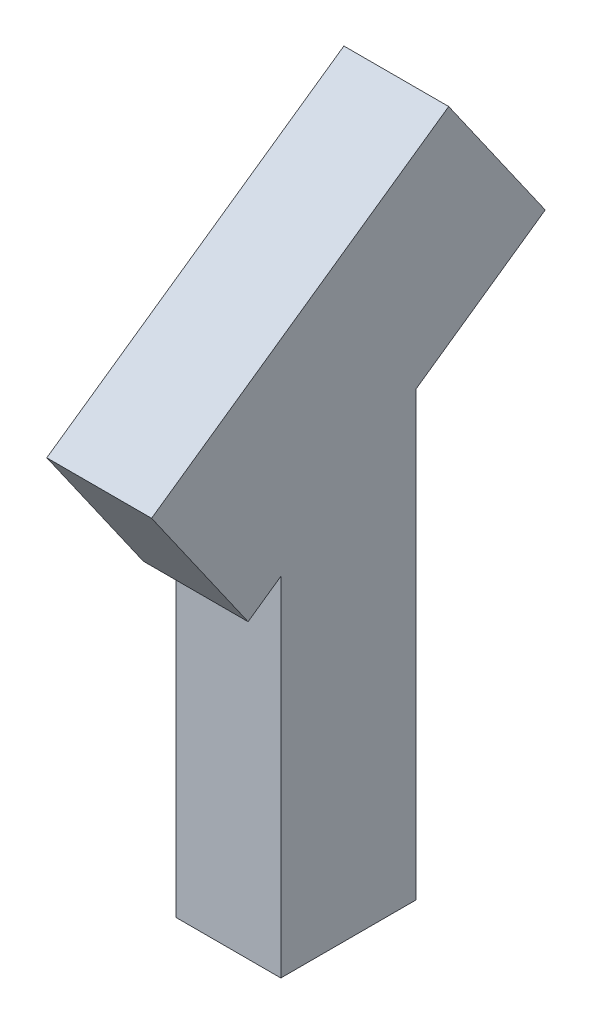
ISO-10303-21;
HEADER;
FILE_DESCRIPTION(('STEP AP214'),'2;1');
FILE_NAME('part.step','',(''),(''),'','','');
FILE_SCHEMA(('AUTOMOTIVE_DESIGN { 1 0 10303 214 1 1 1 1 }'));
ENDSEC;
DATA;
#1=APPLICATION_CONTEXT('core data for automotive mechanical design processes');
#2=APPLICATION_PROTOCOL_DEFINITION('international standard','automotive_design',2000,#1);
#3=PRODUCT_CONTEXT('',#1,'mechanical');
#4=PRODUCT('Part','Part','',(#3));
#5=PRODUCT_RELATED_PRODUCT_CATEGORY('part','',(#4));
#6=PRODUCT_DEFINITION_FORMATION('','',#4);
#7=PRODUCT_DEFINITION_CONTEXT('part definition',#1,'design');
#8=PRODUCT_DEFINITION('design','',#6,#7);
#9=PRODUCT_DEFINITION_SHAPE('','',#8);
#10=(LENGTH_UNIT() NAMED_UNIT(*) SI_UNIT(.MILLI.,.METRE.));
#11=(NAMED_UNIT(*) PLANE_ANGLE_UNIT() SI_UNIT($,.RADIAN.));
#12=(NAMED_UNIT(*) SI_UNIT($,.STERADIAN.) SOLID_ANGLE_UNIT());
#13=UNCERTAINTY_MEASURE_WITH_UNIT(LENGTH_MEASURE(1.E-05),#10,'distance_accuracy_value','');
#14=(GEOMETRIC_REPRESENTATION_CONTEXT(3) GLOBAL_UNCERTAINTY_ASSIGNED_CONTEXT((#13)) GLOBAL_UNIT_ASSIGNED_CONTEXT((#10,
#11,#12)) REPRESENTATION_CONTEXT('',''));
#15=CARTESIAN_POINT('',(0.,0.,0.));
#16=DIRECTION('',(0.,0.,1.));
#17=DIRECTION('',(1.,0.,0.));
#18=AXIS2_PLACEMENT_3D('',#15,#16,#17);
#19=CARTESIAN_POINT('',(38.,0.,49.));
#20=DIRECTION('',(0.,0.,-1.));
#21=DIRECTION('',(-1.,0.,0.));
#22=AXIS2_PLACEMENT_3D('',#19,#20,#21);
#23=PLANE('',#22);
#24=DIRECTION('',(0.,-1.,0.));
#25=VECTOR('',#24,1.);
#26=CARTESIAN_POINT('',(-38.,0.,49.));
#27=LINE('',#26,#25);
#28=CARTESIAN_POINT('',(-38.,252.222580713274,49.));
#29=VERTEX_POINT('',#28);
#30=CARTESIAN_POINT('',(-38.,0.,49.));
#31=VERTEX_POINT('',#30);
#32=EDGE_CURVE('E133',#29,#31,#27,.T.);
#33=ORIENTED_EDGE('',*,*,#32,.T.);
#34=DIRECTION('',(-1.,0.,0.));
#35=VECTOR('',#34,1.);
#36=CARTESIAN_POINT('',(38.,0.,49.));
#37=LINE('',#36,#35);
#38=CARTESIAN_POINT('',(38.,0.,49.));
#39=VERTEX_POINT('',#38);
#40=EDGE_CURVE('E11',#39,#31,#37,.T.);
#41=ORIENTED_EDGE('',*,*,#40,.F.);
#42=DIRECTION('',(0.,-1.,0.));
#43=VECTOR('',#42,1.);
#44=CARTESIAN_POINT('',(38.,0.,49.));
#45=LINE('',#44,#43);
#46=CARTESIAN_POINT('',(38.,252.222580713274,49.));
#47=VERTEX_POINT('',#46);
#48=EDGE_CURVE('E147',#47,#39,#45,.T.);
#49=ORIENTED_EDGE('',*,*,#48,.F.);
#50=DIRECTION('',(-1.,0.,0.));
#51=VECTOR('',#50,1.);
#52=CARTESIAN_POINT('',(38.,252.222580713274,49.));
#53=LINE('',#52,#51);
#54=EDGE_CURVE('E129',#47,#29,#53,.T.);
#55=ORIENTED_EDGE('',*,*,#54,.T.);
#56=EDGE_LOOP('',(#33,#41,#49,#55));
#57=FACE_BOUND('',#56,.T.);
#58=ADVANCED_FACE('F37',(#57),#23,.F.);
#59=CARTESIAN_POINT('',(38.,0.,49.));
#60=DIRECTION('',(0.,1.,0.));
#61=DIRECTION('',(0.,0.,1.));
#62=AXIS2_PLACEMENT_3D('',#59,#60,#61);
#63=PLANE('',#62);
#64=DIRECTION('',(0.,0.,-1.));
#65=VECTOR('',#64,1.);
#66=CARTESIAN_POINT('',(-38.,0.,49.));
#67=LINE('',#66,#65);
#68=CARTESIAN_POINT('',(-38.,0.,-49.));
#69=VERTEX_POINT('',#68);
#70=EDGE_CURVE('E136',#31,#69,#67,.T.);
#71=ORIENTED_EDGE('',*,*,#70,.T.);
#72=DIRECTION('',(-1.,0.,0.));
#73=VECTOR('',#72,1.);
#74=CARTESIAN_POINT('',(38.,0.,-49.));
#75=LINE('',#74,#73);
#76=CARTESIAN_POINT('',(38.,0.,-49.));
#77=VERTEX_POINT('',#76);
#78=EDGE_CURVE('E45',#77,#69,#75,.T.);
#79=ORIENTED_EDGE('',*,*,#78,.F.);
#80=DIRECTION('',(0.,0.,-1.));
#81=VECTOR('',#80,1.);
#82=CARTESIAN_POINT('',(38.,0.,49.));
#83=LINE('',#82,#81);
#84=EDGE_CURVE('E96',#39,#77,#83,.T.);
#85=ORIENTED_EDGE('',*,*,#84,.F.);
#86=ORIENTED_EDGE('',*,*,#40,.T.);
#87=EDGE_LOOP('',(#71,#79,#85,#86));
#88=FACE_BOUND('',#87,.T.);
#89=ADVANCED_FACE('F182',(#88),#63,.F.);
#90=CARTESIAN_POINT('',(38.,0.,-49.));
#91=DIRECTION('',(0.,0.,1.));
#92=DIRECTION('',(1.,0.,0.));
#93=AXIS2_PLACEMENT_3D('',#90,#91,#92);
#94=PLANE('',#93);
#95=DIRECTION('',(0.,1.,0.));
#96=VECTOR('',#95,1.);
#97=CARTESIAN_POINT('',(-38.,0.,-49.));
#98=LINE('',#97,#96);
#99=CARTESIAN_POINT('',(-38.,320.842919457826,-49.));
#100=VERTEX_POINT('',#99);
#101=EDGE_CURVE('E138',#69,#100,#98,.T.);
#102=ORIENTED_EDGE('',*,*,#101,.T.);
#103=DIRECTION('',(-1.,0.,0.));
#104=VECTOR('',#103,1.);
#105=CARTESIAN_POINT('',(38.,320.842919457826,-49.));
#106=LINE('',#105,#104);
#107=CARTESIAN_POINT('',(38.,320.842919457826,-49.));
#108=VERTEX_POINT('',#107);
#109=EDGE_CURVE('E154',#108,#100,#106,.T.);
#110=ORIENTED_EDGE('',*,*,#109,.F.);
#111=DIRECTION('',(0.,1.,0.));
#112=VECTOR('',#111,1.);
#113=CARTESIAN_POINT('',(38.,0.,-49.));
#114=LINE('',#113,#112);
#115=EDGE_CURVE('E162',#77,#108,#114,.T.);
#116=ORIENTED_EDGE('',*,*,#115,.F.);
#117=ORIENTED_EDGE('',*,*,#78,.T.);
#118=EDGE_LOOP('',(#102,#110,#116,#117));
#119=FACE_BOUND('',#118,.T.);
#120=ADVANCED_FACE('F160',(#119),#94,.F.);
#121=CARTESIAN_POINT('',(38.,320.842919457826,-49.));
#122=DIRECTION('',(0.,0.819152044288991,0.573576436351047));
#123=DIRECTION('',(0.,-0.573576436351047,0.819152044288991));
#124=AXIS2_PLACEMENT_3D('',#121,#122,#123);
#125=PLANE('',#124);
#126=DIRECTION('',(0.,0.573576436351047,-0.819152044288991));
#127=VECTOR('',#126,1.);
#128=CARTESIAN_POINT('',(-38.,320.842919457826,-49.));
#129=LINE('',#128,#127);
#130=CARTESIAN_POINT('',(-38.,386.457026678533,-142.706656441416));
#131=VERTEX_POINT('',#130);
#132=EDGE_CURVE('E140',#100,#131,#129,.T.);
#133=ORIENTED_EDGE('',*,*,#132,.T.);
#134=DIRECTION('',(-1.,0.,0.));
#135=VECTOR('',#134,1.);
#136=CARTESIAN_POINT('',(38.,386.457026678533,-142.706656441416));
#137=LINE('',#136,#135);
#138=CARTESIAN_POINT('',(38.,386.457026678533,-142.706656441416));
#139=VERTEX_POINT('',#138);
#140=EDGE_CURVE('E151',#139,#131,#137,.T.);
#141=ORIENTED_EDGE('',*,*,#140,.F.);
#142=DIRECTION('',(0.,0.573576436351047,-0.819152044288991));
#143=VECTOR('',#142,1.);
#144=CARTESIAN_POINT('',(38.,320.842919457826,-49.));
#145=LINE('',#144,#143);
#146=EDGE_CURVE('E174',#108,#139,#145,.T.);
#147=ORIENTED_EDGE('',*,*,#146,.F.);
#148=ORIENTED_EDGE('',*,*,#109,.T.);
#149=EDGE_LOOP('',(#133,#141,#147,#148));
#150=FACE_BOUND('',#149,.T.);
#151=ADVANCED_FACE('F170',(#150),#125,.F.);
#152=CARTESIAN_POINT('',(38.,386.457026678533,-142.706656441416));
#153=DIRECTION('',(0.,-0.573576436351042,0.819152044288995));
#154=DIRECTION('',(0.,-0.819152044288995,-0.573576436351042));
#155=AXIS2_PLACEMENT_3D('',#152,#153,#154);
#156=PLANE('',#155);
#157=DIRECTION('',(0.,0.819152044288995,0.573576436351042));
#158=VECTOR('',#157,1.);
#159=CARTESIAN_POINT('',(-38.,386.457026678533,-142.706656441416));
#160=LINE('',#159,#158);
#161=CARTESIAN_POINT('',(-38.,486.39357608179,-72.7303312065894));
#162=VERTEX_POINT('',#161);
#163=EDGE_CURVE('E142',#131,#162,#160,.T.);
#164=ORIENTED_EDGE('',*,*,#163,.T.);
#165=DIRECTION('',(-1.,0.,0.));
#166=VECTOR('',#165,1.);
#167=CARTESIAN_POINT('',(38.,486.39357608179,-72.7303312065894));
#168=LINE('',#167,#166);
#169=CARTESIAN_POINT('',(38.,486.39357608179,-72.7303312065894));
#170=VERTEX_POINT('',#169);
#171=EDGE_CURVE('E124',#170,#162,#168,.T.);
#172=ORIENTED_EDGE('',*,*,#171,.F.);
#173=DIRECTION('',(0.,0.819152044288995,0.573576436351042));
#174=VECTOR('',#173,1.);
#175=CARTESIAN_POINT('',(38.,386.457026678533,-142.706656441416));
#176=LINE('',#175,#174);
#177=EDGE_CURVE('E115',#139,#170,#176,.T.);
#178=ORIENTED_EDGE('',*,*,#177,.F.);
#179=ORIENTED_EDGE('',*,*,#140,.T.);
#180=EDGE_LOOP('',(#164,#172,#178,#179));
#181=FACE_BOUND('',#180,.T.);
#182=ADVANCED_FACE('F173',(#181),#156,.F.);
#183=CARTESIAN_POINT('',(38.,486.39357608179,-72.7303312065894));
#184=DIRECTION('',(0.,-0.819152044288995,-0.573576436351042));
#185=DIRECTION('',(0.,0.573576436351042,-0.819152044288995));
#186=AXIS2_PLACEMENT_3D('',#183,#184,#185);
#187=PLANE('',#186);
#188=DIRECTION('',(0.,-0.573576436351042,0.819152044288995));
#189=VECTOR('',#188,1.);
#190=CARTESIAN_POINT('',(-38.,486.39357608179,-72.7303312065894));
#191=LINE('',#190,#189);
#192=CARTESIAN_POINT('',(-38.,335.542973321467,142.706656441416));
#193=VERTEX_POINT('',#192);
#194=EDGE_CURVE('E123',#162,#193,#191,.T.);
#195=ORIENTED_EDGE('',*,*,#194,.T.);
#196=DIRECTION('',(-1.,0.,0.));
#197=VECTOR('',#196,1.);
#198=CARTESIAN_POINT('',(38.,335.542973321467,142.706656441416));
#199=LINE('',#198,#197);
#200=CARTESIAN_POINT('',(38.,335.542973321467,142.706656441416));
#201=VERTEX_POINT('',#200);
#202=EDGE_CURVE('E120',#201,#193,#199,.T.);
#203=ORIENTED_EDGE('',*,*,#202,.F.);
#204=DIRECTION('',(0.,-0.573576436351042,0.819152044288995));
#205=VECTOR('',#204,1.);
#206=CARTESIAN_POINT('',(38.,486.39357608179,-72.7303312065894));
#207=LINE('',#206,#205);
#208=EDGE_CURVE('E109',#170,#201,#207,.T.);
#209=ORIENTED_EDGE('',*,*,#208,.F.);
#210=ORIENTED_EDGE('',*,*,#171,.T.);
#211=EDGE_LOOP('',(#195,#203,#209,#210));
#212=FACE_BOUND('',#211,.T.);
#213=ADVANCED_FACE('F121',(#212),#187,.F.);
#214=CARTESIAN_POINT('',(38.,335.542973321467,142.706656441416));
#215=DIRECTION('',(0.,0.573576436351042,-0.819152044288995));
#216=DIRECTION('',(0.,0.819152044288995,0.573576436351042));
#217=AXIS2_PLACEMENT_3D('',#214,#215,#216);
#218=PLANE('',#217);
#219=DIRECTION('',(0.,-0.819152044288995,-0.573576436351042));
#220=VECTOR('',#219,1.);
#221=CARTESIAN_POINT('',(-38.,335.542973321467,142.706656441416));
#222=LINE('',#221,#220);
#223=CARTESIAN_POINT('',(-38.,235.606423918209,72.730331206589));
#224=VERTEX_POINT('',#223);
#225=EDGE_CURVE('E82',#193,#224,#222,.T.);
#226=ORIENTED_EDGE('',*,*,#225,.T.);
#227=DIRECTION('',(-1.,0.,0.));
#228=VECTOR('',#227,1.);
#229=CARTESIAN_POINT('',(38.,235.606423918209,72.730331206589));
#230=LINE('',#229,#228);
#231=CARTESIAN_POINT('',(38.,235.606423918209,72.730331206589));
#232=VERTEX_POINT('',#231);
#233=EDGE_CURVE('E125',#232,#224,#230,.T.);
#234=ORIENTED_EDGE('',*,*,#233,.F.);
#235=DIRECTION('',(0.,-0.819152044288995,-0.573576436351042));
#236=VECTOR('',#235,1.);
#237=CARTESIAN_POINT('',(38.,335.542973321467,142.706656441416));
#238=LINE('',#237,#236);
#239=EDGE_CURVE('E113',#201,#232,#238,.T.);
#240=ORIENTED_EDGE('',*,*,#239,.F.);
#241=ORIENTED_EDGE('',*,*,#202,.T.);
#242=EDGE_LOOP('',(#226,#234,#240,#241));
#243=FACE_BOUND('',#242,.T.);
#244=ADVANCED_FACE('F127',(#243),#218,.F.);
#245=CARTESIAN_POINT('',(38.,252.222580713274,49.));
#246=DIRECTION('',(0.,0.819152044289025,0.573576436350999));
#247=DIRECTION('',(0.,-0.573576436350999,0.819152044289025));
#248=AXIS2_PLACEMENT_3D('',#245,#246,#247);
#249=PLANE('',#248);
#250=DIRECTION('',(0.,0.573576436350999,-0.819152044289025));
#251=VECTOR('',#250,1.);
#252=CARTESIAN_POINT('',(-38.,252.222580713274,49.));
#253=LINE('',#252,#251);
#254=EDGE_CURVE('E88',#224,#29,#253,.T.);
#255=ORIENTED_EDGE('',*,*,#254,.T.);
#256=ORIENTED_EDGE('',*,*,#54,.F.);
#257=DIRECTION('',(0.,0.573576436350999,-0.819152044289025));
#258=VECTOR('',#257,1.);
#259=CARTESIAN_POINT('',(38.,252.222580713274,49.));
#260=LINE('',#259,#258);
#261=EDGE_CURVE('E53',#232,#47,#260,.T.);
#262=ORIENTED_EDGE('',*,*,#261,.F.);
#263=ORIENTED_EDGE('',*,*,#233,.T.);
#264=EDGE_LOOP('',(#255,#256,#262,#263));
#265=FACE_BOUND('',#264,.T.);
#266=ADVANCED_FACE('F198',(#265),#249,.F.);
#267=CARTESIAN_POINT('',(38.,0.,0.));
#268=DIRECTION('',(-1.,0.,0.));
#269=DIRECTION('',(0.,0.,1.));
#270=AXIS2_PLACEMENT_3D('',#267,#268,#269);
#271=PLANE('',#270);
#272=ORIENTED_EDGE('',*,*,#48,.T.);
#273=ORIENTED_EDGE('',*,*,#84,.T.);
#274=ORIENTED_EDGE('',*,*,#115,.T.);
#275=ORIENTED_EDGE('',*,*,#146,.T.);
#276=ORIENTED_EDGE('',*,*,#177,.T.);
#277=ORIENTED_EDGE('',*,*,#208,.T.);
#278=ORIENTED_EDGE('',*,*,#239,.T.);
#279=ORIENTED_EDGE('',*,*,#261,.T.);
#280=EDGE_LOOP('',(#272,#273,#274,#275,#276,#277,#278,#279));
#281=FACE_BOUND('',#280,.T.);
#282=ADVANCED_FACE('F111',(#281),#271,.F.);
#283=CARTESIAN_POINT('',(-38.,0.,0.));
#284=DIRECTION('',(-1.,0.,0.));
#285=DIRECTION('',(0.,0.,1.));
#286=AXIS2_PLACEMENT_3D('',#283,#284,#285);
#287=PLANE('',#286);
#288=ORIENTED_EDGE('',*,*,#32,.F.);
#289=ORIENTED_EDGE('',*,*,#254,.F.);
#290=ORIENTED_EDGE('',*,*,#225,.F.);
#291=ORIENTED_EDGE('',*,*,#194,.F.);
#292=ORIENTED_EDGE('',*,*,#163,.F.);
#293=ORIENTED_EDGE('',*,*,#132,.F.);
#294=ORIENTED_EDGE('',*,*,#101,.F.);
#295=ORIENTED_EDGE('',*,*,#70,.F.);
#296=EDGE_LOOP('',(#288,#289,#290,#291,#292,#293,#294,#295));
#297=FACE_BOUND('',#296,.T.);
#298=ADVANCED_FACE('F166',(#297),#287,.T.);
#299=CLOSED_SHELL('',(#58,#89,#120,#151,#182,#213,#244,#266,#282,#298));
#300=MANIFOLD_SOLID_BREP('B2',#299);
#301=ADVANCED_BREP_SHAPE_REPRESENTATION('',(#18,#300),#14);
#302=SHAPE_DEFINITION_REPRESENTATION(#9,#301);
ENDSEC;
END-ISO-10303-21;
